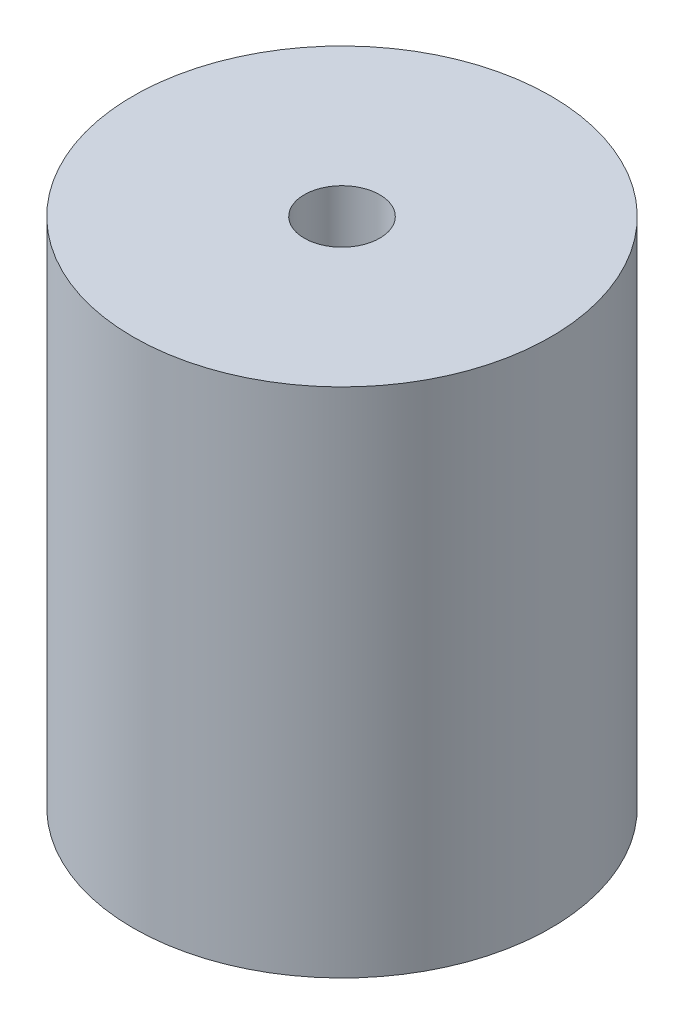
ISO-10303-21;
HEADER;
FILE_DESCRIPTION(('STEP AP214'),'2;1');
FILE_NAME('part.step','',(''),(''),'','','');
FILE_SCHEMA(('AUTOMOTIVE_DESIGN { 1 0 10303 214 1 1 1 1 }'));
ENDSEC;
DATA;
#1=APPLICATION_CONTEXT('core data for automotive mechanical design processes');
#2=APPLICATION_PROTOCOL_DEFINITION('international standard','automotive_design',2000,#1);
#3=PRODUCT_CONTEXT('',#1,'mechanical');
#4=PRODUCT('Part','Part','',(#3));
#5=PRODUCT_RELATED_PRODUCT_CATEGORY('part','',(#4));
#6=PRODUCT_DEFINITION_FORMATION('','',#4);
#7=PRODUCT_DEFINITION_CONTEXT('part definition',#1,'design');
#8=PRODUCT_DEFINITION('design','',#6,#7);
#9=PRODUCT_DEFINITION_SHAPE('','',#8);
#10=(LENGTH_UNIT() NAMED_UNIT(*) SI_UNIT(.MILLI.,.METRE.));
#11=(NAMED_UNIT(*) PLANE_ANGLE_UNIT() SI_UNIT($,.RADIAN.));
#12=(NAMED_UNIT(*) SI_UNIT($,.STERADIAN.) SOLID_ANGLE_UNIT());
#13=UNCERTAINTY_MEASURE_WITH_UNIT(LENGTH_MEASURE(1.E-05),#10,'distance_accuracy_value','');
#14=(GEOMETRIC_REPRESENTATION_CONTEXT(3) GLOBAL_UNCERTAINTY_ASSIGNED_CONTEXT((#13)) GLOBAL_UNIT_ASSIGNED_CONTEXT((#10,
#11,#12)) REPRESENTATION_CONTEXT('',''));
#15=CARTESIAN_POINT('',(0.,0.,0.));
#16=DIRECTION('',(0.,0.,1.));
#17=DIRECTION('',(1.,0.,0.));
#18=AXIS2_PLACEMENT_3D('',#15,#16,#17);
#19=CARTESIAN_POINT('',(0.,19.,0.));
#20=DIRECTION('',(0.,1.,0.));
#21=DIRECTION('',(0.,0.,1.));
#22=AXIS2_PLACEMENT_3D('',#19,#20,#21);
#23=PLANE('',#22);
#24=CARTESIAN_POINT('',(0.,19.,0.));
#25=DIRECTION('',(0.,1.,0.));
#26=DIRECTION('',(0.,0.,1.));
#27=AXIS2_PLACEMENT_3D('',#24,#25,#26);
#28=CIRCLE('',#27,7.75);
#29=CARTESIAN_POINT('',(0.,19.,7.75));
#30=VERTEX_POINT('',#29);
#31=EDGE_CURVE('E10',#30,#30,#28,.T.);
#32=ORIENTED_EDGE('',*,*,#31,.T.);
#33=EDGE_LOOP('',(#32));
#34=FACE_BOUND('',#33,.T.);
#35=CARTESIAN_POINT('',(0.,19.,0.));
#36=DIRECTION('',(0.,1.,0.));
#37=DIRECTION('',(0.,0.,1.));
#38=AXIS2_PLACEMENT_3D('',#35,#36,#37);
#39=CIRCLE('',#38,1.4);
#40=CARTESIAN_POINT('',(0.,19.,1.4));
#41=VERTEX_POINT('',#40);
#42=EDGE_CURVE('E56',#41,#41,#39,.T.);
#43=ORIENTED_EDGE('',*,*,#42,.F.);
#44=EDGE_LOOP('',(#43));
#45=FACE_BOUND('',#44,.T.);
#46=ADVANCED_FACE('F43',(#34,#45),#23,.T.);
#47=CARTESIAN_POINT('',(0.,0.,0.));
#48=DIRECTION('',(0.,1.,0.));
#49=DIRECTION('',(0.,0.,1.));
#50=AXIS2_PLACEMENT_3D('',#47,#48,#49);
#51=PLANE('',#50);
#52=CARTESIAN_POINT('',(0.,0.,0.));
#53=DIRECTION('',(0.,1.,0.));
#54=DIRECTION('',(0.,0.,1.));
#55=AXIS2_PLACEMENT_3D('',#52,#53,#54);
#56=CIRCLE('',#55,7.75);
#57=CARTESIAN_POINT('',(0.,0.,7.75));
#58=VERTEX_POINT('',#57);
#59=EDGE_CURVE('E47',#58,#58,#56,.T.);
#60=ORIENTED_EDGE('',*,*,#59,.F.);
#61=EDGE_LOOP('',(#60));
#62=FACE_BOUND('',#61,.T.);
#63=CARTESIAN_POINT('',(0.,0.,0.));
#64=DIRECTION('',(0.,1.,0.));
#65=DIRECTION('',(0.,0.,1.));
#66=AXIS2_PLACEMENT_3D('',#63,#64,#65);
#67=CIRCLE('',#66,1.4);
#68=CARTESIAN_POINT('',(0.,0.,1.4));
#69=VERTEX_POINT('',#68);
#70=EDGE_CURVE('E58',#69,#69,#67,.T.);
#71=ORIENTED_EDGE('',*,*,#70,.T.);
#72=EDGE_LOOP('',(#71));
#73=FACE_BOUND('',#72,.T.);
#74=ADVANCED_FACE('F70',(#62,#73),#51,.F.);
#75=CARTESIAN_POINT('',(0.,19.,0.));
#76=DIRECTION('',(0.,-1.,0.));
#77=DIRECTION('',(0.,0.,-1.));
#78=AXIS2_PLACEMENT_3D('',#75,#76,#77);
#79=CYLINDRICAL_SURFACE('',#78,7.75);
#80=ORIENTED_EDGE('',*,*,#31,.F.);
#81=EDGE_LOOP('',(#80));
#82=FACE_BOUND('',#81,.T.);
#83=ORIENTED_EDGE('',*,*,#59,.T.);
#84=EDGE_LOOP('',(#83));
#85=FACE_BOUND('',#84,.T.);
#86=ADVANCED_FACE('F45',(#82,#85),#79,.T.);
#87=CARTESIAN_POINT('',(0.,19.,0.));
#88=DIRECTION('',(0.,-1.,0.));
#89=DIRECTION('',(0.,0.,-1.));
#90=AXIS2_PLACEMENT_3D('',#87,#88,#89);
#91=CYLINDRICAL_SURFACE('',#90,1.4);
#92=ORIENTED_EDGE('',*,*,#42,.T.);
#93=EDGE_LOOP('',(#92));
#94=FACE_BOUND('',#93,.T.);
#95=ORIENTED_EDGE('',*,*,#70,.F.);
#96=EDGE_LOOP('',(#95));
#97=FACE_BOUND('',#96,.T.);
#98=ADVANCED_FACE('F66',(#94,#97),#91,.F.);
#99=CLOSED_SHELL('',(#46,#74,#86,#98));
#100=MANIFOLD_SOLID_BREP('B2',#99);
#101=ADVANCED_BREP_SHAPE_REPRESENTATION('',(#18,#100),#14);
#102=SHAPE_DEFINITION_REPRESENTATION(#9,#101);
ENDSEC;
END-ISO-10303-21;
